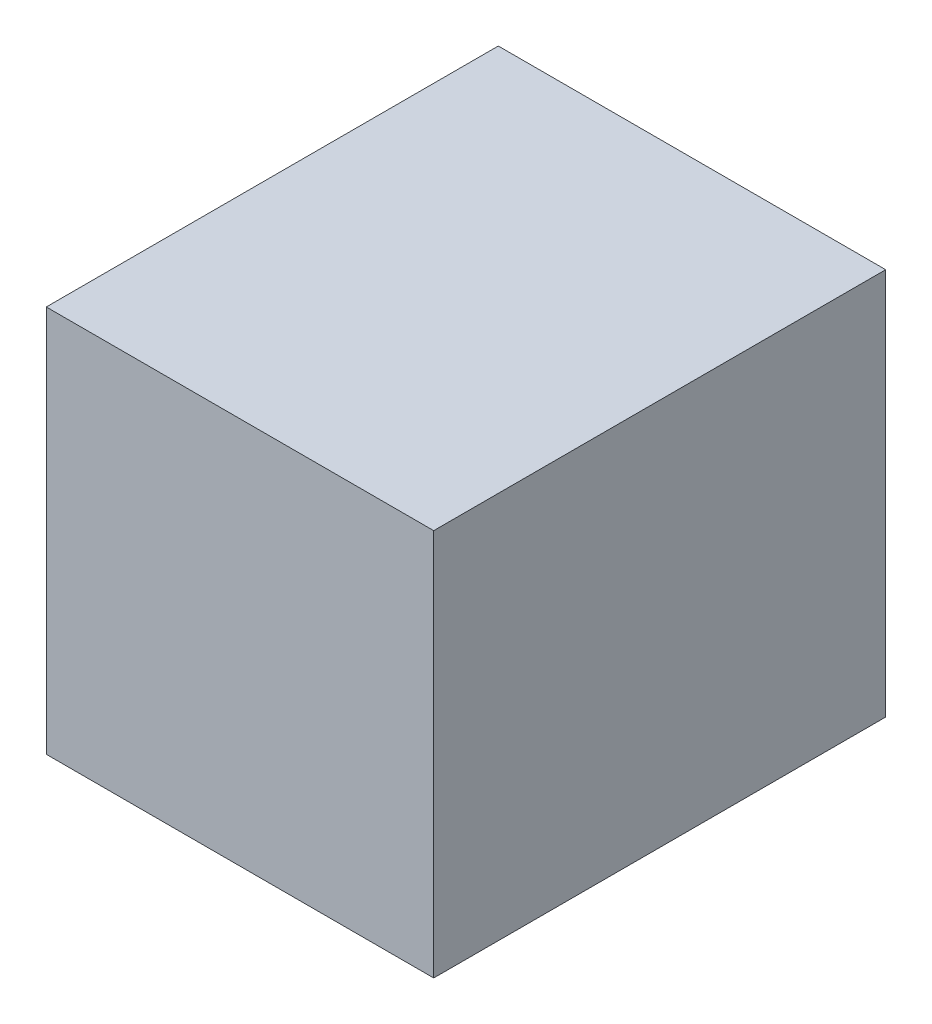
ISO-10303-21;
HEADER;
FILE_DESCRIPTION(('STEP AP214'),'2;1');
FILE_NAME('part.step','',(''),(''),'','','');
FILE_SCHEMA(('AUTOMOTIVE_DESIGN { 1 0 10303 214 1 1 1 1 }'));
ENDSEC;
DATA;
#1=APPLICATION_CONTEXT('core data for automotive mechanical design processes');
#2=APPLICATION_PROTOCOL_DEFINITION('international standard','automotive_design',2000,#1);
#3=PRODUCT_CONTEXT('',#1,'mechanical');
#4=PRODUCT('Part','Part','',(#3));
#5=PRODUCT_RELATED_PRODUCT_CATEGORY('part','',(#4));
#6=PRODUCT_DEFINITION_FORMATION('','',#4);
#7=PRODUCT_DEFINITION_CONTEXT('part definition',#1,'design');
#8=PRODUCT_DEFINITION('design','',#6,#7);
#9=PRODUCT_DEFINITION_SHAPE('','',#8);
#10=(LENGTH_UNIT() NAMED_UNIT(*) SI_UNIT(.MILLI.,.METRE.));
#11=(NAMED_UNIT(*) PLANE_ANGLE_UNIT() SI_UNIT($,.RADIAN.));
#12=(NAMED_UNIT(*) SI_UNIT($,.STERADIAN.) SOLID_ANGLE_UNIT());
#13=UNCERTAINTY_MEASURE_WITH_UNIT(LENGTH_MEASURE(1.E-05),#10,'distance_accuracy_value','');
#14=(GEOMETRIC_REPRESENTATION_CONTEXT(3) GLOBAL_UNCERTAINTY_ASSIGNED_CONTEXT((#13)) GLOBAL_UNIT_ASSIGNED_CONTEXT((#10,
#11,#12)) REPRESENTATION_CONTEXT('',''));
#15=CARTESIAN_POINT('',(0.,0.,0.));
#16=DIRECTION('',(0.,0.,1.));
#17=DIRECTION('',(1.,0.,0.));
#18=AXIS2_PLACEMENT_3D('',#15,#16,#17);
#19=CARTESIAN_POINT('',(5.207,5.162,-8.00099999999999));
#20=DIRECTION('',(-1.,0.,0.));
#21=DIRECTION('',(0.,0.,1.));
#22=AXIS2_PLACEMENT_3D('',#19,#20,#21);
#23=PLANE('',#22);
#24=DIRECTION('',(0.,0.,-1.));
#25=VECTOR('',#24,1.);
#26=CARTESIAN_POINT('',(5.207,4.4,-8.00099999999999));
#27=LINE('',#26,#25);
#28=CARTESIAN_POINT('',(5.207,4.4,-8.00099999999999));
#29=VERTEX_POINT('',#28);
#30=CARTESIAN_POINT('',(5.207,4.4,-8.89));
#31=VERTEX_POINT('',#30);
#32=EDGE_CURVE('E11',#29,#31,#27,.T.);
#33=ORIENTED_EDGE('',*,*,#32,.T.);
#34=DIRECTION('',(0.,-1.,0.));
#35=VECTOR('',#34,1.);
#36=CARTESIAN_POINT('',(5.207,5.162,-8.89));
#37=LINE('',#36,#35);
#38=CARTESIAN_POINT('',(5.207,5.162,-8.89));
#39=VERTEX_POINT('',#38);
#40=EDGE_CURVE('E24',#39,#31,#37,.T.);
#41=ORIENTED_EDGE('',*,*,#40,.F.);
#42=DIRECTION('',(0.,0.,-1.));
#43=VECTOR('',#42,1.);
#44=CARTESIAN_POINT('',(5.207,5.162,-8.00099999999999));
#45=LINE('',#44,#43);
#46=CARTESIAN_POINT('',(5.207,5.162,-8.00099999999999));
#47=VERTEX_POINT('',#46);
#48=EDGE_CURVE('E88',#47,#39,#45,.T.);
#49=ORIENTED_EDGE('',*,*,#48,.F.);
#50=DIRECTION('',(0.,-1.,0.));
#51=VECTOR('',#50,1.);
#52=CARTESIAN_POINT('',(5.207,5.162,-8.00099999999999));
#53=LINE('',#52,#51);
#54=EDGE_CURVE('E77',#47,#29,#53,.T.);
#55=ORIENTED_EDGE('',*,*,#54,.T.);
#56=EDGE_LOOP('',(#33,#41,#49,#55));
#57=FACE_BOUND('',#56,.T.);
#58=ADVANCED_FACE('F17',(#57),#23,.F.);
#59=CARTESIAN_POINT('',(5.207,5.162,-8.89));
#60=DIRECTION('',(0.,0.,1.));
#61=DIRECTION('',(1.,0.,0.));
#62=AXIS2_PLACEMENT_3D('',#59,#60,#61);
#63=PLANE('',#62);
#64=DIRECTION('',(-1.,0.,0.));
#65=VECTOR('',#64,1.);
#66=CARTESIAN_POINT('',(5.207,4.4,-8.89));
#67=LINE('',#66,#65);
#68=CARTESIAN_POINT('',(4.445,4.4,-8.89));
#69=VERTEX_POINT('',#68);
#70=EDGE_CURVE('E85',#31,#69,#67,.T.);
#71=ORIENTED_EDGE('',*,*,#70,.T.);
#72=DIRECTION('',(0.,-1.,0.));
#73=VECTOR('',#72,1.);
#74=CARTESIAN_POINT('',(4.445,5.162,-8.89));
#75=LINE('',#74,#73);
#76=CARTESIAN_POINT('',(4.445,5.162,-8.89));
#77=VERTEX_POINT('',#76);
#78=EDGE_CURVE('E83',#77,#69,#75,.T.);
#79=ORIENTED_EDGE('',*,*,#78,.F.);
#80=DIRECTION('',(-1.,0.,0.));
#81=VECTOR('',#80,1.);
#82=CARTESIAN_POINT('',(5.207,5.162,-8.89));
#83=LINE('',#82,#81);
#84=EDGE_CURVE('E72',#39,#77,#83,.T.);
#85=ORIENTED_EDGE('',*,*,#84,.F.);
#86=ORIENTED_EDGE('',*,*,#40,.T.);
#87=EDGE_LOOP('',(#71,#79,#85,#86));
#88=FACE_BOUND('',#87,.T.);
#89=ADVANCED_FACE('F90',(#88),#63,.F.);
#90=CARTESIAN_POINT('',(4.445,5.162,-8.00099999999999));
#91=DIRECTION('',(1.,0.,0.));
#92=DIRECTION('',(0.,0.,-1.));
#93=AXIS2_PLACEMENT_3D('',#90,#91,#92);
#94=PLANE('',#93);
#95=DIRECTION('',(0.,0.,1.));
#96=VECTOR('',#95,1.);
#97=CARTESIAN_POINT('',(4.445,4.4,-8.00099999999999));
#98=LINE('',#97,#96);
#99=CARTESIAN_POINT('',(4.445,4.4,-8.00099999999999));
#100=VERTEX_POINT('',#99);
#101=EDGE_CURVE('E60',#69,#100,#98,.T.);
#102=ORIENTED_EDGE('',*,*,#101,.T.);
#103=DIRECTION('',(0.,-1.,0.));
#104=VECTOR('',#103,1.);
#105=CARTESIAN_POINT('',(4.445,5.162,-8.00099999999999));
#106=LINE('',#105,#104);
#107=CARTESIAN_POINT('',(4.445,5.162,-8.00099999999999));
#108=VERTEX_POINT('',#107);
#109=EDGE_CURVE('E54',#108,#100,#106,.T.);
#110=ORIENTED_EDGE('',*,*,#109,.F.);
#111=DIRECTION('',(0.,0.,1.));
#112=VECTOR('',#111,1.);
#113=CARTESIAN_POINT('',(4.445,5.162,-8.00099999999999));
#114=LINE('',#113,#112);
#115=EDGE_CURVE('E58',#77,#108,#114,.T.);
#116=ORIENTED_EDGE('',*,*,#115,.F.);
#117=ORIENTED_EDGE('',*,*,#78,.T.);
#118=EDGE_LOOP('',(#102,#110,#116,#117));
#119=FACE_BOUND('',#118,.T.);
#120=ADVANCED_FACE('F56',(#119),#94,.F.);
#121=CARTESIAN_POINT('',(5.207,5.162,-8.00099999999999));
#122=DIRECTION('',(0.,0.,-1.));
#123=DIRECTION('',(-1.,0.,0.));
#124=AXIS2_PLACEMENT_3D('',#121,#122,#123);
#125=PLANE('',#124);
#126=DIRECTION('',(1.,0.,0.));
#127=VECTOR('',#126,1.);
#128=CARTESIAN_POINT('',(5.207,4.4,-8.00099999999999));
#129=LINE('',#128,#127);
#130=EDGE_CURVE('E73',#100,#29,#129,.T.);
#131=ORIENTED_EDGE('',*,*,#130,.T.);
#132=ORIENTED_EDGE('',*,*,#54,.F.);
#133=DIRECTION('',(1.,0.,0.));
#134=VECTOR('',#133,1.);
#135=CARTESIAN_POINT('',(5.207,5.162,-8.00099999999999));
#136=LINE('',#135,#134);
#137=EDGE_CURVE('E70',#108,#47,#136,.T.);
#138=ORIENTED_EDGE('',*,*,#137,.F.);
#139=ORIENTED_EDGE('',*,*,#109,.T.);
#140=EDGE_LOOP('',(#131,#132,#138,#139));
#141=FACE_BOUND('',#140,.T.);
#142=ADVANCED_FACE('F76',(#141),#125,.F.);
#143=CARTESIAN_POINT('',(0.,5.162,0.));
#144=DIRECTION('',(0.,1.,0.));
#145=DIRECTION('',(0.,0.,1.));
#146=AXIS2_PLACEMENT_3D('',#143,#144,#145);
#147=PLANE('',#146);
#148=ORIENTED_EDGE('',*,*,#48,.T.);
#149=ORIENTED_EDGE('',*,*,#84,.T.);
#150=ORIENTED_EDGE('',*,*,#115,.T.);
#151=ORIENTED_EDGE('',*,*,#137,.T.);
#152=EDGE_LOOP('',(#148,#149,#150,#151));
#153=FACE_BOUND('',#152,.T.);
#154=ADVANCED_FACE('F69',(#153),#147,.T.);
#155=CARTESIAN_POINT('',(0.,4.4,0.));
#156=DIRECTION('',(0.,1.,0.));
#157=DIRECTION('',(0.,0.,1.));
#158=AXIS2_PLACEMENT_3D('',#155,#156,#157);
#159=PLANE('',#158);
#160=ORIENTED_EDGE('',*,*,#32,.F.);
#161=ORIENTED_EDGE('',*,*,#130,.F.);
#162=ORIENTED_EDGE('',*,*,#101,.F.);
#163=ORIENTED_EDGE('',*,*,#70,.F.);
#164=EDGE_LOOP('',(#160,#161,#162,#163));
#165=FACE_BOUND('',#164,.T.);
#166=ADVANCED_FACE('F91',(#165),#159,.F.);
#167=CLOSED_SHELL('',(#58,#89,#120,#142,#154,#166));
#168=MANIFOLD_SOLID_BREP('B1',#167);
#169=ADVANCED_BREP_SHAPE_REPRESENTATION('',(#18,#168),#14);
#170=SHAPE_DEFINITION_REPRESENTATION(#9,#169);
ENDSEC;
END-ISO-10303-21;
